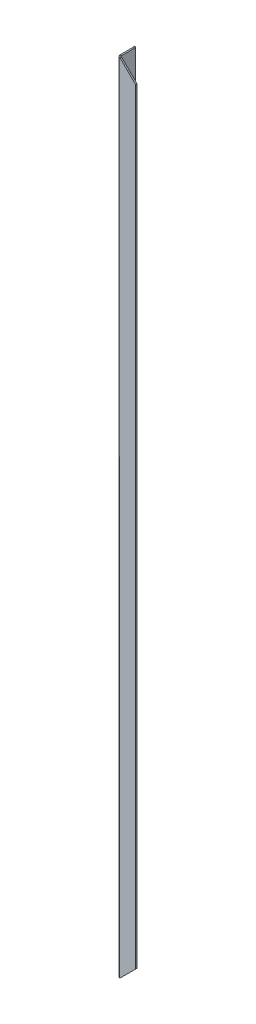
ISO-10303-21;
HEADER;
FILE_DESCRIPTION(('STEP AP214'),'2;1');
FILE_NAME('part.step','',(''),(''),'','','');
FILE_SCHEMA(('AUTOMOTIVE_DESIGN { 1 0 10303 214 1 1 1 1 }'));
ENDSEC;
DATA;
#1=APPLICATION_CONTEXT('core data for automotive mechanical design processes');
#2=APPLICATION_PROTOCOL_DEFINITION('international standard','automotive_design',2000,#1);
#3=PRODUCT_CONTEXT('',#1,'mechanical');
#4=PRODUCT('Part','Part','',(#3));
#5=PRODUCT_RELATED_PRODUCT_CATEGORY('part','',(#4));
#6=PRODUCT_DEFINITION_FORMATION('','',#4);
#7=PRODUCT_DEFINITION_CONTEXT('part definition',#1,'design');
#8=PRODUCT_DEFINITION('design','',#6,#7);
#9=PRODUCT_DEFINITION_SHAPE('','',#8);
#10=(LENGTH_UNIT() NAMED_UNIT(*) SI_UNIT(.MILLI.,.METRE.));
#11=(NAMED_UNIT(*) PLANE_ANGLE_UNIT() SI_UNIT($,.RADIAN.));
#12=(NAMED_UNIT(*) SI_UNIT($,.STERADIAN.) SOLID_ANGLE_UNIT());
#13=UNCERTAINTY_MEASURE_WITH_UNIT(LENGTH_MEASURE(1.E-05),#10,'distance_accuracy_value','');
#14=(GEOMETRIC_REPRESENTATION_CONTEXT(3) GLOBAL_UNCERTAINTY_ASSIGNED_CONTEXT((#13)) GLOBAL_UNIT_ASSIGNED_CONTEXT((#10,
#11,#12)) REPRESENTATION_CONTEXT('',''));
#15=CARTESIAN_POINT('',(0.,0.,0.));
#16=DIRECTION('',(0.,0.,1.));
#17=DIRECTION('',(1.,0.,0.));
#18=AXIS2_PLACEMENT_3D('',#15,#16,#17);
#19=CARTESIAN_POINT('',(-741.499999999995,2.3722795114768E-13,5.68989300120393E-12));
#20=DIRECTION('',(-1.,0.,0.));
#21=DIRECTION('',(0.,0.,1.));
#22=AXIS2_PLACEMENT_3D('',#19,#20,#21);
#23=PLANE('',#22);
#24=DIRECTION('',(0.,-1.,0.));
#25=VECTOR('',#24,1.);
#26=CARTESIAN_POINT('',(-741.5,81.0413169100456,-670.6));
#27=LINE('',#26,#25);
#28=CARTESIAN_POINT('',(-741.499999999999,898.958683089955,-670.6));
#29=VERTEX_POINT('',#28);
#30=CARTESIAN_POINT('',(-741.5,81.0413169100454,-670.6));
#31=VERTEX_POINT('',#30);
#32=EDGE_CURVE('E216',#29,#31,#27,.T.);
#33=ORIENTED_EDGE('',*,*,#32,.F.);
#34=CARTESIAN_POINT('',(-741.5,898.958683089955,-670.6));
#35=CARTESIAN_POINT('',(-741.5,898.968988421705,-670.628279873763));
#36=CARTESIAN_POINT('',(-741.5,898.979844085021,-670.656357906757));
#37=CARTESIAN_POINT('',(-741.5,899.002602043233,-670.712063947291));
#38=CARTESIAN_POINT('',(-741.5,899.014503603506,-670.739692254798));
#39=CARTESIAN_POINT('',(-741.5,899.039314285796,-670.794493027586));
#40=CARTESIAN_POINT('',(-741.5,899.05222344598,-670.821665475551));
#41=CARTESIAN_POINT('',(-741.5,899.079014678656,-670.875542160706));
#42=CARTESIAN_POINT('',(-741.5,899.092897166585,-670.902246191811));
#43=CARTESIAN_POINT('',(-741.5,899.13579419548,-670.981425612632));
#44=CARTESIAN_POINT('',(-741.5,899.16614813854,-671.033165052155));
#45=CARTESIAN_POINT('',(-741.5,899.228628658942,-671.135503833935));
#46=CARTESIAN_POINT('',(-741.5,899.260753405403,-671.186104280306));
#47=CARTESIAN_POINT('',(-741.5,899.292893218813,-671.2366));
#48=B_SPLINE_CURVE_WITH_KNOTS('',3,(#34,#35,#36,#37,#38,#39,#40,#41,#42,#43,#44,#45,#46,#47),
.UNSPECIFIED.,.F.,.F.,(4,2,2,2,2,2,4),(0.,0.0902896640642453,0.180516409364902,
0.270746574152046,0.361015488265461,0.540906287238877,0.720614459104722),.UNSPECIFIED.);
#49=CARTESIAN_POINT('',(-741.5,899.292893218813,-671.2366));
#50=VERTEX_POINT('',#49);
#51=EDGE_CURVE('E84',#29,#50,#48,.T.);
#52=ORIENTED_EDGE('',*,*,#51,.T.);
#53=DIRECTION('',(0.,0.,-1.));
#54=VECTOR('',#53,1.);
#55=CARTESIAN_POINT('',(-741.5,899.292893218813,-685.5));
#56=LINE('',#55,#54);
#57=CARTESIAN_POINT('',(-741.5,899.292893218813,-684.7634));
#58=VERTEX_POINT('',#57);
#59=EDGE_CURVE('E770',#50,#58,#56,.T.);
#60=ORIENTED_EDGE('',*,*,#59,.T.);
#61=CARTESIAN_POINT('',(-741.5,899.889112089738,-685.499999999998));
#62=CARTESIAN_POINT('',(-741.5,899.841449125809,-685.436947267291));
#63=CARTESIAN_POINT('',(-741.5,899.793015983584,-685.374495306884));
#64=CARTESIAN_POINT('',(-741.5,899.69499551586,-685.250504933534));
#65=CARTESIAN_POINT('',(-741.5,899.645408224944,-685.188966493307));
#66=CARTESIAN_POINT('',(-741.5,899.495615047362,-685.00543711312));
#67=CARTESIAN_POINT('',(-741.499999999999,899.394256653781,-684.884375779889));
#68=CARTESIAN_POINT('',(-741.5,899.292893218813,-684.7634));
#69=B_SPLINE_CURVE_WITH_KNOTS('',3,(#61,#62,#63,#64,#65,#66,#67,#68),.UNSPECIFIED.,.F.,.F.,(4,2,
2,4),(0.,0.237091997989213,0.474176901016748,0.947753395880904),.UNSPECIFIED.);
#70=CARTESIAN_POINT('',(-741.5,899.889112089738,-685.499999999999));
#71=VERTEX_POINT('',#70);
#72=EDGE_CURVE('E432',#71,#58,#69,.T.);
#73=ORIENTED_EDGE('',*,*,#72,.F.);
#74=DIRECTION('',(0.,-1.,0.));
#75=VECTOR('',#74,1.);
#76=CARTESIAN_POINT('',(-741.5,0.,-685.5));
#77=LINE('',#76,#75);
#78=CARTESIAN_POINT('',(-741.5,80.1108879102596,-685.499999999999));
#79=VERTEX_POINT('',#78);
#80=EDGE_CURVE('E450',#79,#71,#77,.F.);
#81=ORIENTED_EDGE('',*,*,#80,.F.);
#82=CARTESIAN_POINT('',(-741.5,80.1108879102596,-685.5));
#83=CARTESIAN_POINT('',(-741.5,80.15853377078,-685.436969176551));
#84=CARTESIAN_POINT('',(-741.5,80.206949317319,-685.374538727169));
#85=CARTESIAN_POINT('',(-741.5,80.3049340765374,-685.250590938682));
#86=CARTESIAN_POINT('',(-741.5,80.3545032547745,-685.189073572406));
#87=CARTESIAN_POINT('',(-741.499999999999,80.5043122657763,-685.005521232716));
#88=CARTESIAN_POINT('',(-741.499999999999,80.6057066790805,-684.884417517852));
#89=CARTESIAN_POINT('',(-741.5,80.7071067811866,-684.763399999999));
#90=B_SPLINE_CURVE_WITH_KNOTS('',3,(#82,#83,#84,#85,#86,#87,#88,#89),.UNSPECIFIED.,.F.,.F.,(4,2,
2,4),(0.,0.237008652066209,0.474010237128584,0.947753441843585),.UNSPECIFIED.);
#91=CARTESIAN_POINT('',(-741.5,80.7071067811867,-684.763399999999));
#92=VERTEX_POINT('',#91);
#93=EDGE_CURVE('E440',#79,#92,#90,.T.);
#94=ORIENTED_EDGE('',*,*,#93,.T.);
#95=DIRECTION('',(0.,0.,-1.));
#96=VECTOR('',#95,1.);
#97=CARTESIAN_POINT('',(-741.5,80.7071067811867,-685.5));
#98=LINE('',#97,#96);
#99=CARTESIAN_POINT('',(-741.5,80.7071067811866,-671.236599999999));
#100=VERTEX_POINT('',#99);
#101=EDGE_CURVE('E218',#100,#92,#98,.T.);
#102=ORIENTED_EDGE('',*,*,#101,.F.);
#103=CARTESIAN_POINT('',(-741.50000000002,81.0427855019663,-670.595970237246));
#104=CARTESIAN_POINT('',(-741.500000000007,81.0222499422022,-670.65267210156));
#105=CARTESIAN_POINT('',(-741.500000000002,80.9994875194235,-670.708557271788));
#106=CARTESIAN_POINT('',(-741.499999999998,80.9499069959915,-670.818501824145));
#107=CARTESIAN_POINT('',(-741.499999999999,80.9230889365341,-670.872561224813));
#108=CARTESIAN_POINT('',(-741.5,80.8657092072709,-670.978821420841));
#109=CARTESIAN_POINT('',(-741.5,80.8351365972724,-671.031016183861));
#110=CARTESIAN_POINT('',(-741.5,80.7720844982704,-671.13437578002));
#111=CARTESIAN_POINT('',(-741.499999999999,80.7396018925295,-671.185538735915));
#112=CARTESIAN_POINT('',(-741.5,80.7071067811866,-671.236599999999));
#113=B_SPLINE_CURVE_WITH_KNOTS('',3,(#103,#104,#105,#106,#107,#108,#109,#110,#111,#112),
.UNSPECIFIED.,.F.,.F.,(4,2,2,2,4),(0.,0.180865260117906,0.361728683185805,0.543132209217542,
0.72484043977028),.UNSPECIFIED.);
#114=EDGE_CURVE('E202',#31,#100,#113,.T.);
#115=ORIENTED_EDGE('',*,*,#114,.F.);
#116=EDGE_LOOP('',(#33,#52,#60,#73,#81,#94,#102,#115));
#117=FACE_BOUND('',#116,.T.);
#118=ADVANCED_FACE('F60',(#117),#23,.T.);
#119=CARTESIAN_POINT('',(899.827243143448,899.292893218814,-671.236600000011));
#120=CARTESIAN_POINT('',(899.827243143448,899.228342799945,-671.135204439159));
#121=CARTESIAN_POINT('',(899.827243143448,899.164061592685,-671.033649018222));
#122=CARTESIAN_POINT('',(899.827243143448,899.049552558149,-670.82219316272));
#123=CARTESIAN_POINT('',(899.827243143448,898.99977654488,-670.712758943929));
#124=CARTESIAN_POINT('',(899.827243143448,898.958683089955,-670.600000000011));
#125=B_SPLINE_CURVE_WITH_KNOTS('',3,(#119,#120,#121,#122,#123,#124),.UNSPECIFIED.,.F.,.F.,(4,2,
4),(0.,0.5,1.),.UNSPECIFIED.);
#126=DIRECTION('',(-1.,0.,0.));
#127=VECTOR('',#126,1.);
#128=SURFACE_OF_LINEAR_EXTRUSION('',#125,#127);
#129=ORIENTED_EDGE('',*,*,#51,.F.);
#130=CARTESIAN_POINT('',(-740.,898.958683089955,-670.6));
#131=CARTESIAN_POINT('',(-741.5,898.958683089955,-670.600000000001));
#132=B_SPLINE_CURVE_WITH_KNOTS('',1,(#130,#131),.UNSPECIFIED.,.F.,.F.,(2,2),(0.,1.),.UNSPECIFIED.);
#133=CARTESIAN_POINT('',(-740.,898.958683089955,-670.6));
#134=VERTEX_POINT('',#133);
#135=EDGE_CURVE('E14',#134,#29,#132,.T.);
#136=ORIENTED_EDGE('',*,*,#135,.F.);
#137=CARTESIAN_POINT('',(-740.,899.292893218813,-671.2366));
#138=CARTESIAN_POINT('',(-740.,899.228342799945,-671.135204439148));
#139=CARTESIAN_POINT('',(-740.,899.164061592684,-671.033649018211));
#140=CARTESIAN_POINT('',(-740.,899.049552558149,-670.822193162709));
#141=CARTESIAN_POINT('',(-740.,898.99977654488,-670.712758943918));
#142=CARTESIAN_POINT('',(-740.,898.958683089955,-670.6));
#143=B_SPLINE_CURVE_WITH_KNOTS('',3,(#137,#138,#139,#140,#141,#142),.UNSPECIFIED.,.F.,.F.,(4,2,
4),(0.,0.5,1.),.UNSPECIFIED.);
#144=CARTESIAN_POINT('',(-740.,899.292893218813,-671.2366));
#145=VERTEX_POINT('',#144);
#146=EDGE_CURVE('E220',#145,#134,#143,.T.);
#147=ORIENTED_EDGE('',*,*,#146,.F.);
#148=DIRECTION('',(-1.,0.,0.));
#149=VECTOR('',#148,1.);
#150=CARTESIAN_POINT('',(899.827243143448,899.292893218814,-671.236600000011));
#151=LINE('',#150,#149);
#152=EDGE_CURVE('E500',#145,#50,#151,.T.);
#153=ORIENTED_EDGE('',*,*,#152,.T.);
#154=EDGE_LOOP('',(#129,#136,#147,#153));
#155=FACE_BOUND('',#154,.T.);
#156=ADVANCED_FACE('F62',(#155),#128,.F.);
#157=CARTESIAN_POINT('',(899.827243143448,80.7071067811868,-671.236600000011));
#158=CARTESIAN_POINT('',(899.827243143448,80.7717946428225,-671.134988544565));
#159=CARTESIAN_POINT('',(899.827243143448,80.8362107045051,-671.033215513255));
#160=CARTESIAN_POINT('',(899.827243143448,80.950910513133,-670.821268268285));
#161=CARTESIAN_POINT('',(899.827243143448,81.000532389274,-670.711911239861));
#162=CARTESIAN_POINT('',(899.827243143448,81.0413169100453,-670.600000000011));
#163=B_SPLINE_CURVE_WITH_KNOTS('',3,(#157,#158,#159,#160,#161,#162),.UNSPECIFIED.,.F.,.F.,(4,2,
4),(0.,0.5,1.),.UNSPECIFIED.);
#164=DIRECTION('',(-1.,0.,0.));
#165=VECTOR('',#164,1.);
#166=SURFACE_OF_LINEAR_EXTRUSION('',#163,#165);
#167=CARTESIAN_POINT('',(-740.,81.0413169100451,-670.6));
#168=DIRECTION('',(-1.,0.,0.));
#169=VECTOR('',#168,1.);
#170=LINE('',#167,#169);
#171=CARTESIAN_POINT('',(-740.,81.0413169100452,-670.6));
#172=VERTEX_POINT('',#171);
#173=EDGE_CURVE('E73',#172,#31,#170,.T.);
#174=ORIENTED_EDGE('',*,*,#173,.T.);
#175=ORIENTED_EDGE('',*,*,#114,.T.);
#176=DIRECTION('',(-1.,0.,0.));
#177=VECTOR('',#176,1.);
#178=CARTESIAN_POINT('',(899.827243143448,80.7071067811869,-671.236600000011));
#179=LINE('',#178,#177);
#180=CARTESIAN_POINT('',(-740.,80.7071067811866,-671.236599999999));
#181=VERTEX_POINT('',#180);
#182=EDGE_CURVE('E212',#181,#100,#179,.T.);
#183=ORIENTED_EDGE('',*,*,#182,.F.);
#184=CARTESIAN_POINT('',(-740.,80.7071067811866,-671.236599999999));
#185=CARTESIAN_POINT('',(-740.,80.7717946428223,-671.134988544554));
#186=CARTESIAN_POINT('',(-740.,80.8362107045049,-671.033215513244));
#187=CARTESIAN_POINT('',(-740.,80.9509105131328,-670.821268268274));
#188=CARTESIAN_POINT('',(-740.,81.0005323892738,-670.71191123985));
#189=CARTESIAN_POINT('',(-740.,81.0413169100451,-670.6));
#190=B_SPLINE_CURVE_WITH_KNOTS('',3,(#184,#185,#186,#187,#188,#189),.UNSPECIFIED.,.F.,.F.,(4,2,
4),(0.,0.5,1.),.UNSPECIFIED.);
#191=EDGE_CURVE('E205',#181,#172,#190,.T.);
#192=ORIENTED_EDGE('',*,*,#191,.T.);
#193=EDGE_LOOP('',(#174,#175,#183,#192));
#194=FACE_BOUND('',#193,.T.);
#195=ADVANCED_FACE('F200',(#194),#166,.T.);
#196=CARTESIAN_POINT('',(899.827243143452,80.7071067811871,-5.37070388162419E-12));
#197=DIRECTION('',(0.,-1.,0.));
#198=DIRECTION('',(0.,0.,1.));
#199=AXIS2_PLACEMENT_3D('',#196,#197,#198);
#200=PLANE('',#199);
#201=ORIENTED_EDGE('',*,*,#182,.T.);
#202=ORIENTED_EDGE('',*,*,#101,.T.);
#203=DIRECTION('',(-1.,0.,0.));
#204=VECTOR('',#203,1.);
#205=CARTESIAN_POINT('',(899.827243143448,80.7071067811869,-684.76340000001));
#206=LINE('',#205,#204);
#207=CARTESIAN_POINT('',(-740.,80.7071067811866,-684.763399999999));
#208=VERTEX_POINT('',#207);
#209=EDGE_CURVE('E560',#208,#92,#206,.T.);
#210=ORIENTED_EDGE('',*,*,#209,.F.);
#211=DIRECTION('',(0.,0.,1.));
#212=VECTOR('',#211,1.);
#213=CARTESIAN_POINT('',(-739.999999999995,80.7071067811869,5.64825963778048E-12));
#214=LINE('',#213,#212);
#215=EDGE_CURVE('E469',#208,#181,#214,.T.);
#216=ORIENTED_EDGE('',*,*,#215,.T.);
#217=EDGE_LOOP('',(#201,#202,#210,#216));
#218=FACE_BOUND('',#217,.T.);
#219=ADVANCED_FACE('F522',(#218),#200,.T.);
#220=CARTESIAN_POINT('',(899.827243143448,80.7071067811869,-684.76340000001));
#221=CARTESIAN_POINT('',(899.827243143448,80.5041793942604,-685.005588943309));
#222=CARTESIAN_POINT('',(899.827243143448,80.3014364062662,-685.247925149458));
#223=CARTESIAN_POINT('',(899.827243143448,80.1108879102598,-685.500000000011));
#224=B_SPLINE_CURVE_WITH_KNOTS('',3,(#220,#221,#222,#223),.UNSPECIFIED.,.F.,.F.,(4,4),(0.,1.),.UNSPECIFIED.);
#225=DIRECTION('',(-1.,0.,0.));
#226=VECTOR('',#225,1.);
#227=SURFACE_OF_LINEAR_EXTRUSION('',#224,#226);
#228=ORIENTED_EDGE('',*,*,#93,.F.);
#229=DIRECTION('',(-1.,0.,0.));
#230=VECTOR('',#229,1.);
#231=CARTESIAN_POINT('',(899.827243143448,80.1108879102599,-685.50000000001));
#232=LINE('',#231,#230);
#233=CARTESIAN_POINT('',(-740.,80.1108879102597,-685.499999999999));
#234=VERTEX_POINT('',#233);
#235=EDGE_CURVE('E556',#234,#79,#232,.T.);
#236=ORIENTED_EDGE('',*,*,#235,.F.);
#237=CARTESIAN_POINT('',(-740.,80.7071067811866,-684.763399999999));
#238=CARTESIAN_POINT('',(-740.,80.5041793942602,-685.005588943298));
#239=CARTESIAN_POINT('',(-740.,80.301436406266,-685.247925149447));
#240=CARTESIAN_POINT('',(-740.,80.1108879102596,-685.5));
#241=B_SPLINE_CURVE_WITH_KNOTS('',3,(#237,#238,#239,#240),.UNSPECIFIED.,.F.,.F.,(4,4),(0.,1.),.UNSPECIFIED.);
#242=EDGE_CURVE('E476',#208,#234,#241,.T.);
#243=ORIENTED_EDGE('',*,*,#242,.F.);
#244=ORIENTED_EDGE('',*,*,#209,.T.);
#245=EDGE_LOOP('',(#228,#236,#243,#244));
#246=FACE_BOUND('',#245,.T.);
#247=ADVANCED_FACE('F525',(#246),#227,.F.);
#248=CARTESIAN_POINT('',(899.827243143448,1.80641219342982E-13,-685.50000000001));
#249=DIRECTION('',(0.,0.,1.));
#250=DIRECTION('',(0.,1.,0.));
#251=AXIS2_PLACEMENT_3D('',#248,#249,#250);
#252=PLANE('',#251);
#253=ORIENTED_EDGE('',*,*,#80,.T.);
#254=DIRECTION('',(-1.,0.,0.));
#255=VECTOR('',#254,1.);
#256=CARTESIAN_POINT('',(899.827243143448,899.889112089739,-685.50000000001));
#257=LINE('',#256,#255);
#258=CARTESIAN_POINT('',(-740.,899.889112089738,-685.499999999999));
#259=VERTEX_POINT('',#258);
#260=EDGE_CURVE('E552',#259,#71,#257,.T.);
#261=ORIENTED_EDGE('',*,*,#260,.F.);
#262=DIRECTION('',(0.,1.,0.));
#263=VECTOR('',#262,1.);
#264=CARTESIAN_POINT('',(-740.,0.,-685.499999999999));
#265=LINE('',#264,#263);
#266=EDGE_CURVE('E485',#234,#259,#265,.T.);
#267=ORIENTED_EDGE('',*,*,#266,.F.);
#268=ORIENTED_EDGE('',*,*,#235,.T.);
#269=EDGE_LOOP('',(#253,#261,#267,#268));
#270=FACE_BOUND('',#269,.T.);
#271=ADVANCED_FACE('F529',(#270),#252,.F.);
#272=CARTESIAN_POINT('',(899.827243143447,899.292893218814,-684.763400000011));
#273=CARTESIAN_POINT('',(899.827243143447,899.495796147437,-685.005559752915));
#274=CARTESIAN_POINT('',(899.827243143447,899.698625733102,-685.248007353057));
#275=CARTESIAN_POINT('',(899.827243143448,899.889112089739,-685.500000000009));
#276=B_SPLINE_CURVE_WITH_KNOTS('',3,(#272,#273,#274,#275),.UNSPECIFIED.,.F.,.F.,(4,4),(0.,1.),.UNSPECIFIED.);
#277=DIRECTION('',(-1.,0.,0.));
#278=VECTOR('',#277,1.);
#279=SURFACE_OF_LINEAR_EXTRUSION('',#276,#278);
#280=ORIENTED_EDGE('',*,*,#260,.T.);
#281=ORIENTED_EDGE('',*,*,#72,.T.);
#282=DIRECTION('',(-1.,0.,0.));
#283=VECTOR('',#282,1.);
#284=CARTESIAN_POINT('',(899.827243143447,899.292893218814,-684.763400000011));
#285=LINE('',#284,#283);
#286=CARTESIAN_POINT('',(-740.,899.292893218813,-684.7634));
#287=VERTEX_POINT('',#286);
#288=EDGE_CURVE('E548',#287,#58,#285,.T.);
#289=ORIENTED_EDGE('',*,*,#288,.F.);
#290=CARTESIAN_POINT('',(-740.,899.292893218813,-684.7634));
#291=CARTESIAN_POINT('',(-740.,899.495796147437,-685.005559752904));
#292=CARTESIAN_POINT('',(-740.,899.698625733102,-685.248007353046));
#293=CARTESIAN_POINT('',(-740.,899.889112089738,-685.499999999998));
#294=B_SPLINE_CURVE_WITH_KNOTS('',3,(#290,#291,#292,#293),.UNSPECIFIED.,.F.,.F.,(4,4),(0.,1.),.UNSPECIFIED.);
#295=EDGE_CURVE('E489',#287,#259,#294,.T.);
#296=ORIENTED_EDGE('',*,*,#295,.T.);
#297=EDGE_LOOP('',(#280,#281,#289,#296));
#298=FACE_BOUND('',#297,.T.);
#299=ADVANCED_FACE('F533',(#298),#279,.T.);
#300=CARTESIAN_POINT('',(899.827243143452,899.292893218814,-5.70377078901174E-12));
#301=DIRECTION('',(0.,1.,0.));
#302=DIRECTION('',(0.,0.,-1.));
#303=AXIS2_PLACEMENT_3D('',#300,#301,#302);
#304=PLANE('',#303);
#305=ORIENTED_EDGE('',*,*,#288,.T.);
#306=ORIENTED_EDGE('',*,*,#59,.F.);
#307=ORIENTED_EDGE('',*,*,#152,.F.);
#308=DIRECTION('',(0.,0.,1.));
#309=VECTOR('',#308,1.);
#310=CARTESIAN_POINT('',(-739.999999999995,899.292893218814,5.31519273039294E-12));
#311=LINE('',#310,#309);
#312=EDGE_CURVE('E495',#145,#287,#311,.F.);
#313=ORIENTED_EDGE('',*,*,#312,.T.);
#314=EDGE_LOOP('',(#305,#306,#307,#313));
#315=FACE_BOUND('',#314,.T.);
#316=ADVANCED_FACE('F536',(#315),#304,.T.);
#317=CARTESIAN_POINT('',(-739.999999999995,2.37431388237605E-13,5.68989300120393E-12));
#318=DIRECTION('',(-1.,0.,0.));
#319=DIRECTION('',(0.,0.,1.));
#320=AXIS2_PLACEMENT_3D('',#317,#318,#319);
#321=PLANE('',#320);
#322=ORIENTED_EDGE('',*,*,#146,.T.);
#323=DIRECTION('',(0.,-1.,0.));
#324=VECTOR('',#323,1.);
#325=CARTESIAN_POINT('',(-740.,81.0413169100456,-670.6));
#326=LINE('',#325,#324);
#327=EDGE_CURVE('E579',#134,#172,#326,.T.);
#328=ORIENTED_EDGE('',*,*,#327,.T.);
#329=ORIENTED_EDGE('',*,*,#191,.F.);
#330=ORIENTED_EDGE('',*,*,#215,.F.);
#331=ORIENTED_EDGE('',*,*,#242,.T.);
#332=ORIENTED_EDGE('',*,*,#266,.T.);
#333=ORIENTED_EDGE('',*,*,#295,.F.);
#334=ORIENTED_EDGE('',*,*,#312,.F.);
#335=EDGE_LOOP('',(#322,#328,#329,#330,#331,#332,#333,#334));
#336=FACE_BOUND('',#335,.T.);
#337=ADVANCED_FACE('F462',(#336),#321,.F.);
#338=CARTESIAN_POINT('',(-723.5,0.,-2305.57432256545));
#339=DIRECTION('',(-1.,0.,0.));
#340=DIRECTION('',(0.,0.,1.));
#341=AXIS2_PLACEMENT_3D('',#338,#339,#340);
#342=PLANE('',#341);
#343=DIRECTION('',(0.,0.,1.));
#344=VECTOR('',#343,1.);
#345=CARTESIAN_POINT('',(-723.5,882.792893218813,-2305.57432256545));
#346=LINE('',#345,#344);
#347=CARTESIAN_POINT('',(-723.5,882.792893218813,-670.5));
#348=VERTEX_POINT('',#347);
#349=CARTESIAN_POINT('',(-723.5,882.792893218813,-669.));
#350=VERTEX_POINT('',#349);
#351=EDGE_CURVE('E747',#348,#350,#346,.T.);
#352=ORIENTED_EDGE('',*,*,#351,.T.);
#353=DIRECTION('',(0.,1.,0.));
#354=VECTOR('',#353,1.);
#355=CARTESIAN_POINT('',(-723.5,899.292893218813,-669.));
#356=LINE('',#355,#354);
#357=CARTESIAN_POINT('',(-723.5,97.207106781187,-669.));
#358=VERTEX_POINT('',#357);
#359=EDGE_CURVE('E389',#358,#350,#356,.T.);
#360=ORIENTED_EDGE('',*,*,#359,.F.);
#361=DIRECTION('',(0.,0.,1.));
#362=VECTOR('',#361,1.);
#363=CARTESIAN_POINT('',(-723.5,97.207106781187,-2305.57432256545));
#364=LINE('',#363,#362);
#365=CARTESIAN_POINT('',(-723.5,97.207106781187,-670.5));
#366=VERTEX_POINT('',#365);
#367=EDGE_CURVE('E736',#366,#358,#364,.T.);
#368=ORIENTED_EDGE('',*,*,#367,.F.);
#369=DIRECTION('',(0.,1.,0.));
#370=VECTOR('',#369,1.);
#371=CARTESIAN_POINT('',(-723.5,0.,-670.5));
#372=LINE('',#371,#370);
#373=EDGE_CURVE('E365',#348,#366,#372,.F.);
#374=ORIENTED_EDGE('',*,*,#373,.F.);
#375=EDGE_LOOP('',(#352,#360,#368,#374));
#376=FACE_BOUND('',#375,.T.);
#377=ADVANCED_FACE('F824',(#376),#342,.F.);
#378=CARTESIAN_POINT('',(-739.2634,898.556293218813,-2305.57432256545));
#379=DIRECTION('',(-0.707106781186547,-0.707106781186547,0.));
#380=DIRECTION('',(0.707106781186548,-0.707106781186548,0.));
#381=AXIS2_PLACEMENT_3D('',#378,#379,#380);
#382=PLANE('',#381);
#383=DIRECTION('',(0.,0.,1.));
#384=VECTOR('',#383,1.);
#385=CARTESIAN_POINT('',(-739.2634,898.556293218813,-2305.57432256545));
#386=LINE('',#385,#384);
#387=CARTESIAN_POINT('',(-739.2634,898.556293218813,-670.5));
#388=VERTEX_POINT('',#387);
#389=CARTESIAN_POINT('',(-739.2634,898.556293218813,-669.));
#390=VERTEX_POINT('',#389);
#391=EDGE_CURVE('E744',#388,#390,#386,.T.);
#392=ORIENTED_EDGE('',*,*,#391,.T.);
#393=DIRECTION('',(-0.707106781186545,0.70710678118655,0.));
#394=VECTOR('',#393,1.);
#395=CARTESIAN_POINT('',(-739.2634,898.556293218813,-669.));
#396=LINE('',#395,#394);
#397=EDGE_CURVE('E740',#390,#350,#396,.F.);
#398=ORIENTED_EDGE('',*,*,#397,.T.);
#399=ORIENTED_EDGE('',*,*,#351,.F.);
#400=DIRECTION('',(0.707106781186548,-0.707106781186548,0.));
#401=VECTOR('',#400,1.);
#402=CARTESIAN_POINT('',(-739.2634,898.556293218813,-670.5));
#403=LINE('',#402,#401);
#404=EDGE_CURVE('E397',#388,#348,#403,.T.);
#405=ORIENTED_EDGE('',*,*,#404,.F.);
#406=EDGE_LOOP('',(#392,#398,#399,#405));
#407=FACE_BOUND('',#406,.T.);
#408=ADVANCED_FACE('F830',(#407),#382,.F.);
#409=CARTESIAN_POINT('',(-723.5,97.2071067811869,-2305.57432256545));
#410=DIRECTION('',(-0.707106781186548,0.707106781186547,0.));
#411=DIRECTION('',(-0.707106781186547,-0.707106781186548,0.));
#412=AXIS2_PLACEMENT_3D('',#409,#410,#411);
#413=PLANE('',#412);
#414=ORIENTED_EDGE('',*,*,#367,.T.);
#415=DIRECTION('',(0.707106781186545,0.70710678118655,0.));
#416=VECTOR('',#415,1.);
#417=CARTESIAN_POINT('',(-161.369069826073,659.338036955118,-669.));
#418=LINE('',#417,#416);
#419=CARTESIAN_POINT('',(-739.2634,81.4437067811869,-669.));
#420=VERTEX_POINT('',#419);
#421=EDGE_CURVE('E732',#358,#420,#418,.F.);
#422=ORIENTED_EDGE('',*,*,#421,.T.);
#423=DIRECTION('',(0.,0.,1.));
#424=VECTOR('',#423,1.);
#425=CARTESIAN_POINT('',(-739.2634,81.4437067811869,-2305.57432256545));
#426=LINE('',#425,#424);
#427=CARTESIAN_POINT('',(-739.2634,81.4437067811869,-670.5));
#428=VERTEX_POINT('',#427);
#429=EDGE_CURVE('E681',#428,#420,#426,.T.);
#430=ORIENTED_EDGE('',*,*,#429,.F.);
#431=DIRECTION('',(-0.707106781186547,-0.707106781186548,0.));
#432=VECTOR('',#431,1.);
#433=CARTESIAN_POINT('',(-723.5,97.2071067811869,-670.5));
#434=LINE('',#433,#432);
#435=EDGE_CURVE('E727',#366,#428,#434,.T.);
#436=ORIENTED_EDGE('',*,*,#435,.F.);
#437=EDGE_LOOP('',(#414,#422,#430,#436));
#438=FACE_BOUND('',#437,.T.);
#439=ADVANCED_FACE('F836',(#438),#413,.F.);
#440=CARTESIAN_POINT('',(0.,0.,-670.5));
#441=DIRECTION('',(0.,0.,-1.));
#442=DIRECTION('',(-1.,0.,0.));
#443=AXIS2_PLACEMENT_3D('',#440,#441,#442);
#444=PLANE('',#443);
#445=ORIENTED_EDGE('',*,*,#435,.T.);
#446=CARTESIAN_POINT('',(-739.2634,81.4437067811869,-670.5));
#447=CARTESIAN_POINT('',(-739.316394479192,81.4325957568851,-670.5));
#448=CARTESIAN_POINT('',(-739.36939055895,81.4214905608094,-670.5));
#449=CARTESIAN_POINT('',(-739.475404818772,81.3993861194853,-670.5));
#450=CARTESIAN_POINT('',(-739.528422998854,81.3883868743171,-670.5));
#451=CARTESIAN_POINT('',(-739.687534118897,81.3556905184769,-670.5));
#452=CARTESIAN_POINT('',(-739.793688430569,81.3342937649971,-670.5));
#453=CARTESIAN_POINT('',(-739.9,81.3136746604392,-670.5));
#454=B_SPLINE_CURVE_WITH_KNOTS('',3,(#446,#447,#448,#449,#450,#451,#452,#453),.UNSPECIFIED.,.F.,
.F.,(4,2,2,4),(0.,0.162440904892474,0.324881932599178,0.649749289177657),.UNSPECIFIED.);
#455=CARTESIAN_POINT('',(-739.9,81.3136746604391,-670.5));
#456=VERTEX_POINT('',#455);
#457=EDGE_CURVE('E700',#428,#456,#454,.T.);
#458=ORIENTED_EDGE('',*,*,#457,.T.);
#459=DIRECTION('',(0.,1.,0.));
#460=VECTOR('',#459,1.);
#461=CARTESIAN_POINT('',(-739.899999999999,81.3136746604393,-670.5));
#462=LINE('',#461,#460);
#463=CARTESIAN_POINT('',(-739.9,898.686325339561,-670.5));
#464=VERTEX_POINT('',#463);
#465=EDGE_CURVE('E373',#456,#464,#462,.T.);
#466=ORIENTED_EDGE('',*,*,#465,.T.);
#467=CARTESIAN_POINT('',(-739.2634,898.556293218813,-670.5));
#468=CARTESIAN_POINT('',(-739.316394479192,898.567404243115,-670.499999999999));
#469=CARTESIAN_POINT('',(-739.369390558949,898.578509439191,-670.499999999999));
#470=CARTESIAN_POINT('',(-739.475404818771,898.600613880515,-670.499999999999));
#471=CARTESIAN_POINT('',(-739.528422998853,898.611613125683,-670.5));
#472=CARTESIAN_POINT('',(-739.687534118897,898.644309481523,-670.500000000001));
#473=CARTESIAN_POINT('',(-739.793688430569,898.665706235003,-670.500000000002));
#474=CARTESIAN_POINT('',(-739.9,898.686325339561,-670.5));
#475=B_SPLINE_CURVE_WITH_KNOTS('',3,(#467,#468,#469,#470,#471,#472,#473,#474),.UNSPECIFIED.,.F.,
.F.,(4,2,2,4),(0.,0.162440904891977,0.324881932598692,0.649749289177843),.UNSPECIFIED.);
#476=EDGE_CURVE('E356',#388,#464,#475,.T.);
#477=ORIENTED_EDGE('',*,*,#476,.F.);
#478=ORIENTED_EDGE('',*,*,#404,.T.);
#479=ORIENTED_EDGE('',*,*,#373,.T.);
#480=EDGE_LOOP('',(#445,#458,#466,#477,#478,#479));
#481=FACE_BOUND('',#480,.T.);
#482=ADVANCED_FACE('F345',(#481),#444,.T.);
#483=CARTESIAN_POINT('',(-739.2634,898.556293218813,-2305.57432256545));
#484=CARTESIAN_POINT('',(-739.475377604784,898.60073725551,-2305.57432256545));
#485=CARTESIAN_POINT('',(-739.687374345086,898.645086645381,-2305.57432256545));
#486=CARTESIAN_POINT('',(-739.9,898.686325339561,-2305.57432256545));
#487=B_SPLINE_CURVE_WITH_KNOTS('',3,(#483,#484,#485,#486),.UNSPECIFIED.,.F.,.F.,(4,4),(0.,1.),.UNSPECIFIED.);
#488=DIRECTION('',(0.,0.,1.));
#489=VECTOR('',#488,1.);
#490=SURFACE_OF_LINEAR_EXTRUSION('',#487,#489);
#491=CARTESIAN_POINT('',(-739.2634,898.556293218813,-669.));
#492=CARTESIAN_POINT('',(-739.475377604784,898.60073725551,-669.));
#493=CARTESIAN_POINT('',(-739.687374345086,898.645086645381,-669.));
#494=CARTESIAN_POINT('',(-739.9,898.686325339561,-669.));
#495=B_SPLINE_CURVE_WITH_KNOTS('',3,(#491,#492,#493,#494),.UNSPECIFIED.,.F.,.F.,(4,4),(0.,1.),.UNSPECIFIED.);
#496=CARTESIAN_POINT('',(-739.9,898.686325339561,-669.000000000001));
#497=VERTEX_POINT('',#496);
#498=EDGE_CURVE('E678',#390,#497,#495,.T.);
#499=ORIENTED_EDGE('',*,*,#498,.F.);
#500=ORIENTED_EDGE('',*,*,#391,.F.);
#501=ORIENTED_EDGE('',*,*,#476,.T.);
#502=CARTESIAN_POINT('',(-739.9,898.686325339561,-670.5));
#503=DIRECTION('',(0.,0.,1.));
#504=VECTOR('',#503,1.);
#505=LINE('',#502,#504);
#506=EDGE_CURVE('E310',#464,#497,#505,.T.);
#507=ORIENTED_EDGE('',*,*,#506,.T.);
#508=EDGE_LOOP('',(#499,#500,#501,#507));
#509=FACE_BOUND('',#508,.T.);
#510=ADVANCED_FACE('F339',(#509),#490,.T.);
#511=CARTESIAN_POINT('',(0.,0.,-669.));
#512=DIRECTION('',(0.,0.,-1.));
#513=DIRECTION('',(-1.,0.,0.));
#514=AXIS2_PLACEMENT_3D('',#511,#512,#513);
#515=PLANE('',#514);
#516=CARTESIAN_POINT('',(-739.2634,81.4437067811869,-669.));
#517=CARTESIAN_POINT('',(-739.475377604784,81.3992627444901,-669.));
#518=CARTESIAN_POINT('',(-739.687374345085,81.3549133546189,-669.));
#519=CARTESIAN_POINT('',(-739.9,81.3136746604392,-669.));
#520=B_SPLINE_CURVE_WITH_KNOTS('',3,(#516,#517,#518,#519),.UNSPECIFIED.,.F.,.F.,(4,4),(0.,1.),.UNSPECIFIED.);
#521=CARTESIAN_POINT('',(-739.899999999999,81.3136746604391,-669.));
#522=VERTEX_POINT('',#521);
#523=EDGE_CURVE('E233',#420,#522,#520,.T.);
#524=ORIENTED_EDGE('',*,*,#523,.F.);
#525=ORIENTED_EDGE('',*,*,#421,.F.);
#526=ORIENTED_EDGE('',*,*,#359,.T.);
#527=ORIENTED_EDGE('',*,*,#397,.F.);
#528=ORIENTED_EDGE('',*,*,#498,.T.);
#529=DIRECTION('',(0.,1.,0.));
#530=VECTOR('',#529,1.);
#531=CARTESIAN_POINT('',(-739.899999999999,81.3136746604393,-669.));
#532=LINE('',#531,#530);
#533=EDGE_CURVE('E676',#522,#497,#532,.T.);
#534=ORIENTED_EDGE('',*,*,#533,.F.);
#535=EDGE_LOOP('',(#524,#525,#526,#527,#528,#534));
#536=FACE_BOUND('',#535,.T.);
#537=ADVANCED_FACE('F344',(#536),#515,.F.);
#538=CARTESIAN_POINT('',(-739.2634,81.4437067811869,-2305.57432256545));
#539=CARTESIAN_POINT('',(-739.475377604784,81.3992627444901,-2305.57432256545));
#540=CARTESIAN_POINT('',(-739.687374345085,81.3549133546189,-2305.57432256545));
#541=CARTESIAN_POINT('',(-739.9,81.3136746604392,-2305.57432256545));
#542=B_SPLINE_CURVE_WITH_KNOTS('',3,(#538,#539,#540,#541),.UNSPECIFIED.,.F.,.F.,(4,4),(0.,1.),.UNSPECIFIED.);
#543=DIRECTION('',(0.,0.,1.));
#544=VECTOR('',#543,1.);
#545=SURFACE_OF_LINEAR_EXTRUSION('',#542,#544);
#546=ORIENTED_EDGE('',*,*,#429,.T.);
#547=ORIENTED_EDGE('',*,*,#523,.T.);
#548=CARTESIAN_POINT('',(-739.9,81.3136746604391,-670.5));
#549=CARTESIAN_POINT('',(-739.899999999999,81.3136746604391,-669.));
#550=B_SPLINE_CURVE_WITH_KNOTS('',1,(#548,#549),.UNSPECIFIED.,.F.,.F.,(2,2),(0.,1.),.UNSPECIFIED.);
#551=EDGE_CURVE('E238',#456,#522,#550,.T.);
#552=ORIENTED_EDGE('',*,*,#551,.F.);
#553=ORIENTED_EDGE('',*,*,#457,.F.);
#554=EDGE_LOOP('',(#546,#547,#552,#553));
#555=FACE_BOUND('',#554,.T.);
#556=ADVANCED_FACE('F379',(#555),#545,.F.);
#557=CARTESIAN_POINT('',(-739.9,898.686325339561,-669.));
#558=CARTESIAN_POINT('',(-740.109476833306,898.709025863376,-669.));
#559=CARTESIAN_POINT('',(-740.318796614975,898.73171829796,-669.041643717331));
#560=CARTESIAN_POINT('',(-740.705790368594,898.777111256359,-669.201941778633));
#561=CARTESIAN_POINT('',(-740.88327475196,898.799807735558,-669.320533052163));
#562=CARTESIAN_POINT('',(-741.179466947837,898.845200693958,-669.61672524804));
#563=CARTESIAN_POINT('',(-741.298058221367,898.867897173157,-669.794209631407));
#564=CARTESIAN_POINT('',(-741.458356282669,898.913290131556,-670.181203385026));
#565=CARTESIAN_POINT('',(-741.5,898.93598256614,-670.390523166694));
#566=CARTESIAN_POINT('',(-741.5,898.958683089955,-670.600000000001));
#567=CARTESIAN_POINT('',(-739.9,898.686325339561,-670.5));
#568=CARTESIAN_POINT('',(-739.913090558476,898.709022840167,-670.5));
#569=CARTESIAN_POINT('',(-739.926174788436,898.73171829796,-670.502602732333));
#570=CARTESIAN_POINT('',(-739.950361898037,898.777111256359,-670.512621361165));
#571=CARTESIAN_POINT('',(-739.961454671997,898.799807735558,-670.52003331576));
#572=CARTESIAN_POINT('',(-739.97996668424,898.845200693958,-670.538545328003));
#573=CARTESIAN_POINT('',(-739.987378638835,898.867897173157,-670.549638101963));
#574=CARTESIAN_POINT('',(-739.997397267667,898.913290131556,-670.573825211564));
#575=CARTESIAN_POINT('',(-740.,898.935985589349,-670.586909441524));
#576=CARTESIAN_POINT('',(-740.,898.958683089955,-670.6));
#577=B_SPLINE_SURFACE_WITH_KNOTS('',1,3,((#557,#558,#559,#560,#561,#562,#563,#564,#565,#566),
(#567,#568,#569,#570,#571,#572,#573,#574,#575,#576)),.UNSPECIFIED.,.F.,.F.,.F.,(2,2),(4,2,2,2,
4),(0.,1.),(0.,0.25,0.5,0.75,1.),.UNSPECIFIED.);
#578=CARTESIAN_POINT('',(-739.9,898.686325339561,-670.5));
#579=CARTESIAN_POINT('',(-739.913090558476,898.709022840167,-670.5));
#580=CARTESIAN_POINT('',(-739.926174788436,898.73171829796,-670.502602732333));
#581=CARTESIAN_POINT('',(-739.950361898037,898.777111256359,-670.512621361165));
#582=CARTESIAN_POINT('',(-739.961454671997,898.799807735558,-670.52003331576));
#583=CARTESIAN_POINT('',(-739.97996668424,898.845200693958,-670.538545328003));
#584=CARTESIAN_POINT('',(-739.987378638835,898.867897173157,-670.549638101963));
#585=CARTESIAN_POINT('',(-739.997397267667,898.913290131556,-670.573825211564));
#586=CARTESIAN_POINT('',(-740.,898.935985589349,-670.586909441524));
#587=CARTESIAN_POINT('',(-740.,898.958683089955,-670.6));
#588=B_SPLINE_CURVE_WITH_KNOTS('',3,(#578,#579,#580,#581,#582,#583,#584,#585,#586,#587),
.UNSPECIFIED.,.F.,.F.,(4,2,2,2,4),(0.,0.25,0.5,0.75,1.),.UNSPECIFIED.);
#589=EDGE_CURVE('E241',#464,#134,#588,.T.);
#590=CARTESIAN_POINT('',(-741.5,898.958683089955,-670.600000000001));
#591=CARTESIAN_POINT('',(-741.5,898.93598256614,-670.390523166694));
#592=CARTESIAN_POINT('',(-741.458356282669,898.913290131556,-670.181203385026));
#593=CARTESIAN_POINT('',(-741.298058221367,898.867897173157,-669.794209631407));
#594=CARTESIAN_POINT('',(-741.179466947837,898.845200693958,-669.61672524804));
#595=CARTESIAN_POINT('',(-740.88327475196,898.799807735558,-669.320533052163));
#596=CARTESIAN_POINT('',(-740.705790368594,898.777111256359,-669.201941778633));
#597=CARTESIAN_POINT('',(-740.318796614975,898.73171829796,-669.041643717331));
#598=CARTESIAN_POINT('',(-740.109476833306,898.709025863376,-669.));
#599=CARTESIAN_POINT('',(-739.9,898.686325339561,-669.));
#600=B_SPLINE_CURVE_WITH_KNOTS('',3,(#590,#591,#592,#593,#594,#595,#596,#597,#598,#599),
.UNSPECIFIED.,.F.,.F.,(4,2,2,2,4),(0.,0.25,0.5,0.75,1.),.UNSPECIFIED.);
#601=EDGE_CURVE('E230',#497,#29,#600,.F.);
#602=ORIENTED_EDGE('',*,*,#506,.F.);
#603=ORIENTED_EDGE('',*,*,#589,.T.);
#604=ORIENTED_EDGE('',*,*,#135,.T.);
#605=ORIENTED_EDGE('',*,*,#601,.F.);
#606=EDGE_LOOP('',(#602,#603,#604,#605));
#607=FACE_BOUND('',#606,.T.);
#608=ADVANCED_FACE('F266',(#607),#577,.T.);
#609=CARTESIAN_POINT('',(-741.5,81.0413169100454,-670.6));
#610=CARTESIAN_POINT('',(-741.5,81.06401743386,-670.390523166693));
#611=CARTESIAN_POINT('',(-741.458356282669,81.0867098684443,-670.181203385025));
#612=CARTESIAN_POINT('',(-741.298058221367,81.1321028268432,-669.794209631407));
#613=CARTESIAN_POINT('',(-741.179466947837,81.1547993060428,-669.61672524804));
#614=CARTESIAN_POINT('',(-740.88327475196,81.2001922644417,-669.320533052163));
#615=CARTESIAN_POINT('',(-740.705790368593,81.2228887436413,-669.201941778633));
#616=CARTESIAN_POINT('',(-740.318796614974,81.2682817020402,-669.041643717331));
#617=CARTESIAN_POINT('',(-740.109476833306,81.2909741366245,-669.));
#618=CARTESIAN_POINT('',(-739.899999999999,81.3136746604391,-669.));
#619=CARTESIAN_POINT('',(-740.,81.0413169100454,-670.6));
#620=CARTESIAN_POINT('',(-740.,81.0640144106515,-670.586909441524));
#621=CARTESIAN_POINT('',(-739.997397267667,81.0867098684443,-670.573825211564));
#622=CARTESIAN_POINT('',(-739.987378638835,81.1321028268432,-670.549638101963));
#623=CARTESIAN_POINT('',(-739.97996668424,81.1547993060428,-670.538545328002));
#624=CARTESIAN_POINT('',(-739.961454671997,81.2001922644417,-670.52003331576));
#625=CARTESIAN_POINT('',(-739.950361898037,81.2228887436413,-670.512621361165));
#626=CARTESIAN_POINT('',(-739.926174788436,81.2682817020402,-670.502602732333));
#627=CARTESIAN_POINT('',(-739.913090558476,81.290977159833,-670.5));
#628=CARTESIAN_POINT('',(-739.9,81.3136746604391,-670.5));
#629=B_SPLINE_SURFACE_WITH_KNOTS('',1,3,((#609,#610,#611,#612,#613,#614,#615,#616,#617,#618),
(#619,#620,#621,#622,#623,#624,#625,#626,#627,#628)),.UNSPECIFIED.,.F.,.F.,.F.,(2,2),(4,2,2,2,
4),(0.,1.),(0.,0.25,0.5,0.75,1.),.UNSPECIFIED.);
#630=CARTESIAN_POINT('',(-740.,81.0413169100454,-670.6));
#631=CARTESIAN_POINT('',(-740.,81.0640144106515,-670.586909441524));
#632=CARTESIAN_POINT('',(-739.997397267667,81.0867098684443,-670.573825211564));
#633=CARTESIAN_POINT('',(-739.987378638835,81.1321028268432,-670.549638101963));
#634=CARTESIAN_POINT('',(-739.97996668424,81.1547993060428,-670.538545328002));
#635=CARTESIAN_POINT('',(-739.961454671997,81.2001922644417,-670.52003331576));
#636=CARTESIAN_POINT('',(-739.950361898037,81.2228887436413,-670.512621361165));
#637=CARTESIAN_POINT('',(-739.926174788436,81.2682817020402,-670.502602732333));
#638=CARTESIAN_POINT('',(-739.913090558476,81.290977159833,-670.5));
#639=CARTESIAN_POINT('',(-739.9,81.3136746604391,-670.5));
#640=B_SPLINE_CURVE_WITH_KNOTS('',3,(#630,#631,#632,#633,#634,#635,#636,#637,#638,#639),
.UNSPECIFIED.,.F.,.F.,(4,2,2,2,4),(0.,0.25,0.5,0.75,1.),.UNSPECIFIED.);
#641=EDGE_CURVE('E622',#172,#456,#640,.T.);
#642=CARTESIAN_POINT('',(-739.899999999999,81.3136746604391,-669.));
#643=CARTESIAN_POINT('',(-740.109476833306,81.2909741366245,-669.));
#644=CARTESIAN_POINT('',(-740.318796614974,81.2682817020402,-669.041643717331));
#645=CARTESIAN_POINT('',(-740.705790368593,81.2228887436413,-669.201941778633));
#646=CARTESIAN_POINT('',(-740.88327475196,81.2001922644417,-669.320533052163));
#647=CARTESIAN_POINT('',(-741.179466947837,81.1547993060428,-669.61672524804));
#648=CARTESIAN_POINT('',(-741.298058221367,81.1321028268432,-669.794209631407));
#649=CARTESIAN_POINT('',(-741.458356282669,81.0867098684443,-670.181203385025));
#650=CARTESIAN_POINT('',(-741.5,81.06401743386,-670.390523166693));
#651=CARTESIAN_POINT('',(-741.5,81.0413169100454,-670.6));
#652=B_SPLINE_CURVE_WITH_KNOTS('',3,(#642,#643,#644,#645,#646,#647,#648,#649,#650,#651),
.UNSPECIFIED.,.F.,.F.,(4,2,2,2,4),(0.,0.25,0.5,0.75,1.),.UNSPECIFIED.);
#653=EDGE_CURVE('E226',#31,#522,#652,.F.);
#654=ORIENTED_EDGE('',*,*,#173,.F.);
#655=ORIENTED_EDGE('',*,*,#641,.T.);
#656=ORIENTED_EDGE('',*,*,#551,.T.);
#657=ORIENTED_EDGE('',*,*,#653,.F.);
#658=EDGE_LOOP('',(#654,#655,#656,#657));
#659=FACE_BOUND('',#658,.T.);
#660=ADVANCED_FACE('F236',(#659),#629,.T.);
#661=CARTESIAN_POINT('',(-739.9,-739.226421098911,-670.6));
#662=DIRECTION('',(0.,1.,0.));
#663=DIRECTION('',(0.,0.,1.));
#664=AXIS2_PLACEMENT_3D('',#661,#662,#663);
#665=CYLINDRICAL_SURFACE('',#664,1.59999999999999);
#666=ORIENTED_EDGE('',*,*,#653,.T.);
#667=ORIENTED_EDGE('',*,*,#533,.T.);
#668=ORIENTED_EDGE('',*,*,#601,.T.);
#669=ORIENTED_EDGE('',*,*,#32,.T.);
#670=EDGE_LOOP('',(#666,#667,#668,#669));
#671=FACE_BOUND('',#670,.T.);
#672=ADVANCED_FACE('F225',(#671),#665,.T.);
#673=CARTESIAN_POINT('',(-739.9,-739.226421098911,-670.6));
#674=DIRECTION('',(0.,1.,0.));
#675=DIRECTION('',(0.,0.,1.));
#676=AXIS2_PLACEMENT_3D('',#673,#674,#675);
#677=CYLINDRICAL_SURFACE('',#676,0.100000000000043);
#678=ORIENTED_EDGE('',*,*,#641,.F.);
#679=ORIENTED_EDGE('',*,*,#327,.F.);
#680=ORIENTED_EDGE('',*,*,#589,.F.);
#681=ORIENTED_EDGE('',*,*,#465,.F.);
#682=EDGE_LOOP('',(#678,#679,#680,#681));
#683=FACE_BOUND('',#682,.T.);
#684=ADVANCED_FACE('F268',(#683),#677,.F.);
#685=CLOSED_SHELL('',(#118,#156,#195,#219,#247,#271,#299,#316,#337,#377,#408,#439,#482,#510,
#537,#556,#608,#660,#672,#684));
#686=MANIFOLD_SOLID_BREP('B2',#685);
#687=ADVANCED_BREP_SHAPE_REPRESENTATION('',(#18,#686),#14);
#688=SHAPE_DEFINITION_REPRESENTATION(#9,#687);
ENDSEC;
END-ISO-10303-21;
